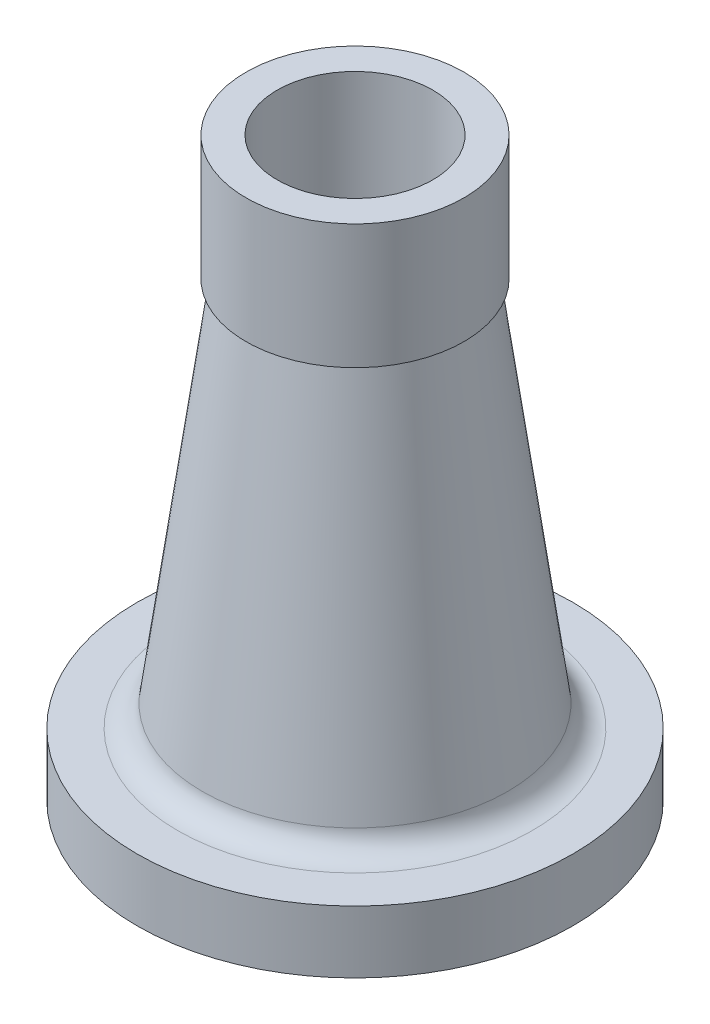
ISO-10303-21;
HEADER;
FILE_DESCRIPTION(('STEP AP214'),'2;1');
FILE_NAME('part.step','',(''),(''),'','','');
FILE_SCHEMA(('AUTOMOTIVE_DESIGN { 1 0 10303 214 1 1 1 1 }'));
ENDSEC;
DATA;
#1=APPLICATION_CONTEXT('core data for automotive mechanical design processes');
#2=APPLICATION_PROTOCOL_DEFINITION('international standard','automotive_design',2000,#1);
#3=PRODUCT_CONTEXT('',#1,'mechanical');
#4=PRODUCT('Part','Part','',(#3));
#5=PRODUCT_RELATED_PRODUCT_CATEGORY('part','',(#4));
#6=PRODUCT_DEFINITION_FORMATION('','',#4);
#7=PRODUCT_DEFINITION_CONTEXT('part definition',#1,'design');
#8=PRODUCT_DEFINITION('design','',#6,#7);
#9=PRODUCT_DEFINITION_SHAPE('','',#8);
#10=(LENGTH_UNIT() NAMED_UNIT(*) SI_UNIT(.MILLI.,.METRE.));
#11=(NAMED_UNIT(*) PLANE_ANGLE_UNIT() SI_UNIT($,.RADIAN.));
#12=(NAMED_UNIT(*) SI_UNIT($,.STERADIAN.) SOLID_ANGLE_UNIT());
#13=UNCERTAINTY_MEASURE_WITH_UNIT(LENGTH_MEASURE(1.E-05),#10,'distance_accuracy_value','');
#14=(GEOMETRIC_REPRESENTATION_CONTEXT(3) GLOBAL_UNCERTAINTY_ASSIGNED_CONTEXT((#13)) GLOBAL_UNIT_ASSIGNED_CONTEXT((#10,
#11,#12)) REPRESENTATION_CONTEXT('',''));
#15=CARTESIAN_POINT('',(0.,0.,0.));
#16=DIRECTION('',(0.,0.,1.));
#17=DIRECTION('',(1.,0.,0.));
#18=AXIS2_PLACEMENT_3D('',#15,#16,#17);
#19=CARTESIAN_POINT('',(0.,0.,0.));
#20=DIRECTION('',(0.,-1.,0.));
#21=DIRECTION('',(0.,0.,-1.));
#22=AXIS2_PLACEMENT_3D('',#19,#20,#21);
#23=CYLINDRICAL_SURFACE('',#22,50.);
#24=CARTESIAN_POINT('',(0.,0.,0.));
#25=DIRECTION('',(0.,-1.,0.));
#26=DIRECTION('',(0.,0.,-1.));
#27=AXIS2_PLACEMENT_3D('',#24,#25,#26);
#28=CIRCLE('',#27,50.);
#29=CARTESIAN_POINT('',(0.,0.,-50.));
#30=VERTEX_POINT('',#29);
#31=EDGE_CURVE('E50',#30,#30,#28,.T.);
#32=ORIENTED_EDGE('',*,*,#31,.T.);
#33=EDGE_LOOP('',(#32));
#34=FACE_BOUND('',#33,.T.);
#35=CARTESIAN_POINT('',(0.,3.,0.));
#36=DIRECTION('',(0.,-1.,0.));
#37=DIRECTION('',(0.,0.,-1.));
#38=AXIS2_PLACEMENT_3D('',#35,#36,#37);
#39=CIRCLE('',#38,50.);
#40=CARTESIAN_POINT('',(0.,3.,-50.));
#41=VERTEX_POINT('',#40);
#42=EDGE_CURVE('E89',#41,#41,#39,.T.);
#43=ORIENTED_EDGE('',*,*,#42,.F.);
#44=EDGE_LOOP('',(#43));
#45=FACE_BOUND('',#44,.T.);
#46=ADVANCED_FACE('F37',(#34,#45),#23,.F.);
#47=CARTESIAN_POINT('',(50.,0.,0.));
#48=DIRECTION('',(0.,-1.,0.));
#49=DIRECTION('',(0.,0.,-1.));
#50=AXIS2_PLACEMENT_3D('',#47,#48,#49);
#51=PLANE('',#50);
#52=CARTESIAN_POINT('',(0.,0.,0.));
#53=DIRECTION('',(0.,-1.,0.));
#54=DIRECTION('',(0.,0.,-1.));
#55=AXIS2_PLACEMENT_3D('',#52,#53,#54);
#56=CIRCLE('',#55,70.);
#57=CARTESIAN_POINT('',(0.,0.,-70.));
#58=VERTEX_POINT('',#57);
#59=EDGE_CURVE('E55',#58,#58,#56,.T.);
#60=ORIENTED_EDGE('',*,*,#59,.T.);
#61=EDGE_LOOP('',(#60));
#62=FACE_BOUND('',#61,.T.);
#63=ORIENTED_EDGE('',*,*,#31,.F.);
#64=EDGE_LOOP('',(#63));
#65=FACE_BOUND('',#64,.T.);
#66=ADVANCED_FACE('F98',(#62,#65),#51,.T.);
#67=CARTESIAN_POINT('',(0.,0.,0.));
#68=DIRECTION('',(0.,-1.,0.));
#69=DIRECTION('',(0.,0.,-1.));
#70=AXIS2_PLACEMENT_3D('',#67,#68,#69);
#71=CYLINDRICAL_SURFACE('',#70,70.);
#72=CARTESIAN_POINT('',(0.,20.,0.));
#73=DIRECTION('',(0.,-1.,0.));
#74=DIRECTION('',(0.,0.,-1.));
#75=AXIS2_PLACEMENT_3D('',#72,#73,#74);
#76=CIRCLE('',#75,70.);
#77=CARTESIAN_POINT('',(0.,20.,-70.));
#78=VERTEX_POINT('',#77);
#79=EDGE_CURVE('E61',#78,#78,#76,.T.);
#80=ORIENTED_EDGE('',*,*,#79,.T.);
#81=EDGE_LOOP('',(#80));
#82=FACE_BOUND('',#81,.T.);
#83=ORIENTED_EDGE('',*,*,#59,.F.);
#84=EDGE_LOOP('',(#83));
#85=FACE_BOUND('',#84,.T.);
#86=ADVANCED_FACE('F103',(#82,#85),#71,.T.);
#87=CARTESIAN_POINT('',(70.,20.,0.));
#88=DIRECTION('',(0.,1.,0.));
#89=DIRECTION('',(0.,0.,1.));
#90=AXIS2_PLACEMENT_3D('',#87,#88,#89);
#91=PLANE('',#90);
#92=CARTESIAN_POINT('',(0.,20.,0.));
#93=DIRECTION('',(0.,1.,0.));
#94=DIRECTION('',(0.,0.,1.));
#95=AXIS2_PLACEMENT_3D('',#92,#93,#94);
#96=CIRCLE('',#95,56.9856450256374);
#97=CARTESIAN_POINT('',(0.,20.,56.9856450256374));
#98=VERTEX_POINT('',#97);
#99=EDGE_CURVE('E45',#98,#98,#96,.F.);
#100=ORIENTED_EDGE('',*,*,#99,.T.);
#101=EDGE_LOOP('',(#100));
#102=FACE_BOUND('',#101,.T.);
#103=ORIENTED_EDGE('',*,*,#79,.F.);
#104=EDGE_LOOP('',(#103));
#105=FACE_BOUND('',#104,.T.);
#106=ADVANCED_FACE('F109',(#102,#105),#91,.T.);
#107=CARTESIAN_POINT('',(0.,20.,0.));
#108=DIRECTION('',(0.,-1.,0.));
#109=DIRECTION('',(0.,0.,-1.));
#110=AXIS2_PLACEMENT_3D('',#107,#108,#109);
#111=CONICAL_SURFACE('',#110,50.,0.135170698649009);
#112=CARTESIAN_POINT('',(0.,26.9219243634863,0.));
#113=DIRECTION('',(0.,-1.,0.));
#114=DIRECTION('',(0.,0.,-1.));
#115=AXIS2_PLACEMENT_3D('',#112,#113,#114);
#116=CIRCLE('',#115,49.0586182865659);
#117=CARTESIAN_POINT('',(0.,26.9219243634863,-49.0586182865659));
#118=VERTEX_POINT('',#117);
#119=EDGE_CURVE('E10',#118,#118,#116,.F.);
#120=ORIENTED_EDGE('',*,*,#119,.T.);
#121=EDGE_LOOP('',(#120));
#122=FACE_BOUND('',#121,.T.);
#123=CARTESIAN_POINT('',(0.,145.,0.));
#124=DIRECTION('',(0.,-1.,0.));
#125=DIRECTION('',(0.,0.,-1.));
#126=AXIS2_PLACEMENT_3D('',#123,#124,#125);
#127=CIRCLE('',#126,33.);
#128=CARTESIAN_POINT('',(0.,145.,-33.));
#129=VERTEX_POINT('',#128);
#130=EDGE_CURVE('E65',#129,#129,#127,.T.);
#131=ORIENTED_EDGE('',*,*,#130,.T.);
#132=EDGE_LOOP('',(#131));
#133=FACE_BOUND('',#132,.T.);
#134=ADVANCED_FACE('F113',(#122,#133),#111,.T.);
#135=CARTESIAN_POINT('',(33.,145.,0.));
#136=DIRECTION('',(0.,-1.,0.));
#137=DIRECTION('',(0.,0.,-1.));
#138=AXIS2_PLACEMENT_3D('',#135,#136,#137);
#139=PLANE('',#138);
#140=CARTESIAN_POINT('',(0.,145.,0.));
#141=DIRECTION('',(0.,-1.,0.));
#142=DIRECTION('',(0.,0.,-1.));
#143=AXIS2_PLACEMENT_3D('',#140,#141,#142);
#144=CIRCLE('',#143,35.);
#145=CARTESIAN_POINT('',(0.,145.,-35.));
#146=VERTEX_POINT('',#145);
#147=EDGE_CURVE('E69',#146,#146,#144,.T.);
#148=ORIENTED_EDGE('',*,*,#147,.T.);
#149=EDGE_LOOP('',(#148));
#150=FACE_BOUND('',#149,.T.);
#151=ORIENTED_EDGE('',*,*,#130,.F.);
#152=EDGE_LOOP('',(#151));
#153=FACE_BOUND('',#152,.T.);
#154=ADVANCED_FACE('F116',(#150,#153),#139,.T.);
#155=CARTESIAN_POINT('',(0.,0.,0.));
#156=DIRECTION('',(0.,-1.,0.));
#157=DIRECTION('',(0.,0.,-1.));
#158=AXIS2_PLACEMENT_3D('',#155,#156,#157);
#159=CYLINDRICAL_SURFACE('',#158,35.);
#160=CARTESIAN_POINT('',(0.,185.,0.));
#161=DIRECTION('',(0.,-1.,0.));
#162=DIRECTION('',(0.,0.,-1.));
#163=AXIS2_PLACEMENT_3D('',#160,#161,#162);
#164=CIRCLE('',#163,35.);
#165=CARTESIAN_POINT('',(0.,185.,-35.));
#166=VERTEX_POINT('',#165);
#167=EDGE_CURVE('E73',#166,#166,#164,.T.);
#168=ORIENTED_EDGE('',*,*,#167,.T.);
#169=EDGE_LOOP('',(#168));
#170=FACE_BOUND('',#169,.T.);
#171=ORIENTED_EDGE('',*,*,#147,.F.);
#172=EDGE_LOOP('',(#171));
#173=FACE_BOUND('',#172,.T.);
#174=ADVANCED_FACE('F119',(#170,#173),#159,.T.);
#175=CARTESIAN_POINT('',(35.,185.,0.));
#176=DIRECTION('',(0.,1.,0.));
#177=DIRECTION('',(0.,0.,1.));
#178=AXIS2_PLACEMENT_3D('',#175,#176,#177);
#179=PLANE('',#178);
#180=CARTESIAN_POINT('',(0.,185.,0.));
#181=DIRECTION('',(0.,-1.,0.));
#182=DIRECTION('',(0.,0.,-1.));
#183=AXIS2_PLACEMENT_3D('',#180,#181,#182);
#184=CIRCLE('',#183,25.);
#185=CARTESIAN_POINT('',(0.,185.,-25.));
#186=VERTEX_POINT('',#185);
#187=EDGE_CURVE('E77',#186,#186,#184,.T.);
#188=ORIENTED_EDGE('',*,*,#187,.T.);
#189=EDGE_LOOP('',(#188));
#190=FACE_BOUND('',#189,.T.);
#191=ORIENTED_EDGE('',*,*,#167,.F.);
#192=EDGE_LOOP('',(#191));
#193=FACE_BOUND('',#192,.T.);
#194=ADVANCED_FACE('F123',(#190,#193),#179,.T.);
#195=CARTESIAN_POINT('',(0.,0.,0.));
#196=DIRECTION('',(0.,-1.,0.));
#197=DIRECTION('',(0.,0.,-1.));
#198=AXIS2_PLACEMENT_3D('',#195,#196,#197);
#199=CYLINDRICAL_SURFACE('',#198,25.);
#200=CARTESIAN_POINT('',(0.,129.617233220244,0.));
#201=DIRECTION('',(0.,-1.,0.));
#202=DIRECTION('',(0.,0.,-1.));
#203=AXIS2_PLACEMENT_3D('',#200,#201,#202);
#204=CIRCLE('',#203,25.);
#205=CARTESIAN_POINT('',(0.,129.617233220244,-25.));
#206=VERTEX_POINT('',#205);
#207=EDGE_CURVE('E81',#206,#206,#204,.T.);
#208=ORIENTED_EDGE('',*,*,#207,.T.);
#209=EDGE_LOOP('',(#208));
#210=FACE_BOUND('',#209,.T.);
#211=ORIENTED_EDGE('',*,*,#187,.F.);
#212=EDGE_LOOP('',(#211));
#213=FACE_BOUND('',#212,.T.);
#214=ADVANCED_FACE('F127',(#210,#213),#199,.F.);
#215=CARTESIAN_POINT('',(0.,129.617233220244,0.));
#216=DIRECTION('',(0.,-1.,0.));
#217=DIRECTION('',(0.,0.,-1.));
#218=AXIS2_PLACEMENT_3D('',#215,#216,#217);
#219=CONICAL_SURFACE('',#218,25.,0.135170698649009);
#220=CARTESIAN_POINT('',(0.,3.,0.));
#221=DIRECTION('',(0.,-1.,0.));
#222=DIRECTION('',(0.,0.,-1.));
#223=AXIS2_PLACEMENT_3D('',#220,#221,#222);
#224=CIRCLE('',#223,42.2199437179532);
#225=CARTESIAN_POINT('',(0.,3.,-42.2199437179532));
#226=VERTEX_POINT('',#225);
#227=EDGE_CURVE('E85',#226,#226,#224,.T.);
#228=ORIENTED_EDGE('',*,*,#227,.T.);
#229=EDGE_LOOP('',(#228));
#230=FACE_BOUND('',#229,.T.);
#231=ORIENTED_EDGE('',*,*,#207,.F.);
#232=EDGE_LOOP('',(#231));
#233=FACE_BOUND('',#232,.T.);
#234=ADVANCED_FACE('F131',(#230,#233),#219,.F.);
#235=CARTESIAN_POINT('',(42.2199437179532,3.,0.));
#236=DIRECTION('',(0.,-1.,0.));
#237=DIRECTION('',(0.,0.,-1.));
#238=AXIS2_PLACEMENT_3D('',#235,#236,#237);
#239=PLANE('',#238);
#240=ORIENTED_EDGE('',*,*,#42,.T.);
#241=EDGE_LOOP('',(#240));
#242=FACE_BOUND('',#241,.T.);
#243=ORIENTED_EDGE('',*,*,#227,.F.);
#244=EDGE_LOOP('',(#243));
#245=FACE_BOUND('',#244,.T.);
#246=ADVANCED_FACE('F94',(#242,#245),#239,.T.);
#247=CARTESIAN_POINT('',(0.,28.,0.));
#248=DIRECTION('',(0.,1.,0.));
#249=DIRECTION('',(0.,0.,1.));
#250=AXIS2_PLACEMENT_3D('',#247,#248,#249);
#251=TOROIDAL_SURFACE('',#250,56.9856450256374,8.);
#252=ORIENTED_EDGE('',*,*,#119,.F.);
#253=EDGE_LOOP('',(#252));
#254=FACE_BOUND('',#253,.T.);
#255=ORIENTED_EDGE('',*,*,#99,.F.);
#256=EDGE_LOOP('',(#255));
#257=FACE_BOUND('',#256,.T.);
#258=ADVANCED_FACE('F39',(#254,#257),#251,.F.);
#259=CLOSED_SHELL('',(#46,#66,#86,#106,#134,#154,#174,#194,#214,#234,#246,#258));
#260=MANIFOLD_SOLID_BREP('B2',#259);
#261=ADVANCED_BREP_SHAPE_REPRESENTATION('',(#18,#260),#14);
#262=SHAPE_DEFINITION_REPRESENTATION(#9,#261);
ENDSEC;
END-ISO-10303-21;
